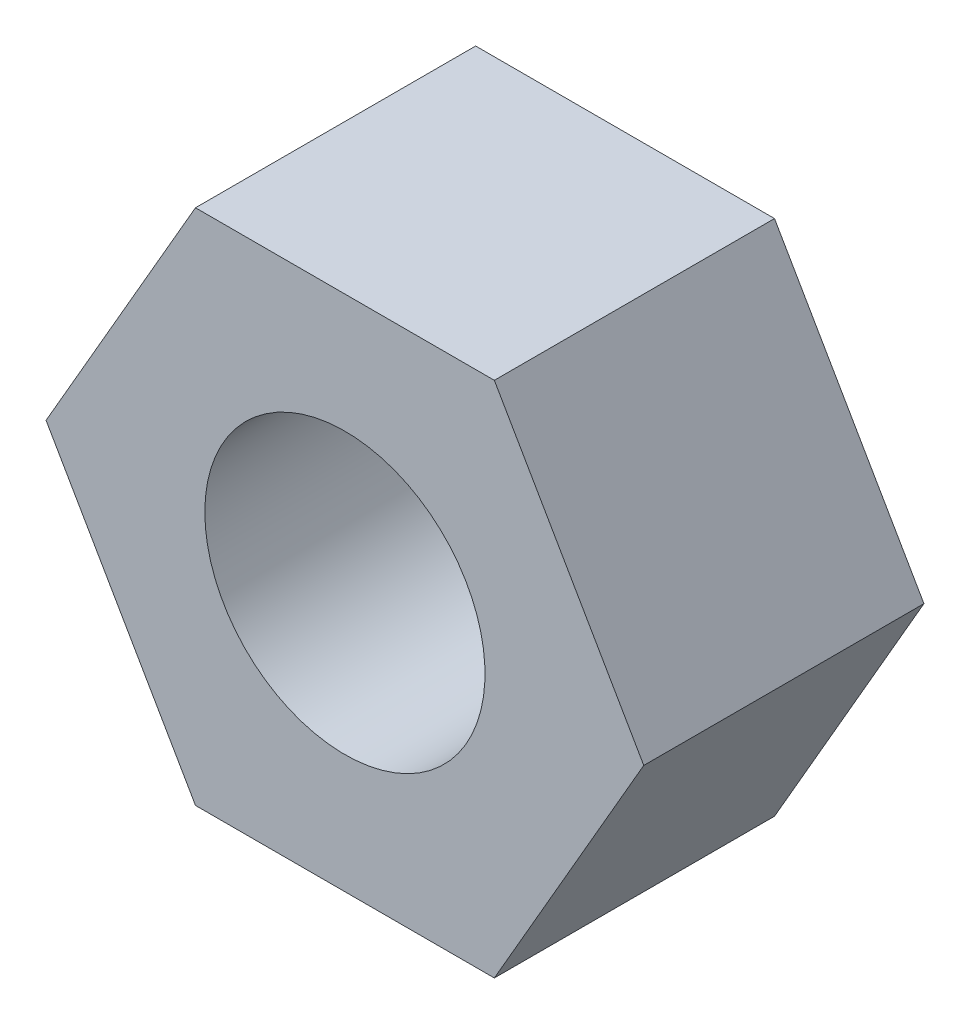
ISO-10303-21;
HEADER;
FILE_DESCRIPTION(('STEP AP214'),'2;1');
FILE_NAME('part.step','',(''),(''),'','','');
FILE_SCHEMA(('AUTOMOTIVE_DESIGN { 1 0 10303 214 1 1 1 1 }'));
ENDSEC;
DATA;
#1=APPLICATION_CONTEXT('core data for automotive mechanical design processes');
#2=APPLICATION_PROTOCOL_DEFINITION('international standard','automotive_design',2000,#1);
#3=PRODUCT_CONTEXT('',#1,'mechanical');
#4=PRODUCT('Part','Part','',(#3));
#5=PRODUCT_RELATED_PRODUCT_CATEGORY('part','',(#4));
#6=PRODUCT_DEFINITION_FORMATION('','',#4);
#7=PRODUCT_DEFINITION_CONTEXT('part definition',#1,'design');
#8=PRODUCT_DEFINITION('design','',#6,#7);
#9=PRODUCT_DEFINITION_SHAPE('','',#8);
#10=(LENGTH_UNIT() NAMED_UNIT(*) SI_UNIT(.MILLI.,.METRE.));
#11=(NAMED_UNIT(*) PLANE_ANGLE_UNIT() SI_UNIT($,.RADIAN.));
#12=(NAMED_UNIT(*) SI_UNIT($,.STERADIAN.) SOLID_ANGLE_UNIT());
#13=UNCERTAINTY_MEASURE_WITH_UNIT(LENGTH_MEASURE(1.E-05),#10,'distance_accuracy_value','');
#14=(GEOMETRIC_REPRESENTATION_CONTEXT(3) GLOBAL_UNCERTAINTY_ASSIGNED_CONTEXT((#13)) GLOBAL_UNIT_ASSIGNED_CONTEXT((#10,
#11,#12)) REPRESENTATION_CONTEXT('',''));
#15=CARTESIAN_POINT('',(0.,0.,0.));
#16=DIRECTION('',(0.,0.,1.));
#17=DIRECTION('',(1.,0.,0.));
#18=AXIS2_PLACEMENT_3D('',#15,#16,#17);
#19=CARTESIAN_POINT('',(3.2,0.,3.));
#20=DIRECTION('',(-0.866025403784439,-0.5,0.));
#21=DIRECTION('',(0.5,-0.866025403784439,0.));
#22=AXIS2_PLACEMENT_3D('',#19,#20,#21);
#23=PLANE('',#22);
#24=DIRECTION('',(-0.5,0.866025403784439,0.));
#25=VECTOR('',#24,1.);
#26=CARTESIAN_POINT('',(3.2,0.,0.));
#27=LINE('',#26,#25);
#28=CARTESIAN_POINT('',(3.2,0.,0.));
#29=VERTEX_POINT('',#28);
#30=CARTESIAN_POINT('',(1.6,2.7712812921102,0.));
#31=VERTEX_POINT('',#30);
#32=EDGE_CURVE('E128',#29,#31,#27,.T.);
#33=ORIENTED_EDGE('',*,*,#32,.T.);
#34=DIRECTION('',(0.,0.,-1.));
#35=VECTOR('',#34,1.);
#36=CARTESIAN_POINT('',(1.6,2.7712812921102,3.));
#37=LINE('',#36,#35);
#38=CARTESIAN_POINT('',(1.6,2.7712812921102,3.));
#39=VERTEX_POINT('',#38);
#40=EDGE_CURVE('E11',#39,#31,#37,.T.);
#41=ORIENTED_EDGE('',*,*,#40,.F.);
#42=DIRECTION('',(-0.5,0.866025403784439,0.));
#43=VECTOR('',#42,1.);
#44=CARTESIAN_POINT('',(3.2,0.,3.));
#45=LINE('',#44,#43);
#46=CARTESIAN_POINT('',(3.2,0.,3.));
#47=VERTEX_POINT('',#46);
#48=EDGE_CURVE('E145',#47,#39,#45,.T.);
#49=ORIENTED_EDGE('',*,*,#48,.F.);
#50=DIRECTION('',(0.,0.,-1.));
#51=VECTOR('',#50,1.);
#52=CARTESIAN_POINT('',(3.2,0.,3.));
#53=LINE('',#52,#51);
#54=EDGE_CURVE('E124',#47,#29,#53,.T.);
#55=ORIENTED_EDGE('',*,*,#54,.T.);
#56=EDGE_LOOP('',(#33,#41,#49,#55));
#57=FACE_BOUND('',#56,.T.);
#58=ADVANCED_FACE('F39',(#57),#23,.F.);
#59=CARTESIAN_POINT('',(1.6,2.7712812921102,3.));
#60=DIRECTION('',(0.,-1.,0.));
#61=DIRECTION('',(0.,0.,-1.));
#62=AXIS2_PLACEMENT_3D('',#59,#60,#61);
#63=PLANE('',#62);
#64=DIRECTION('',(-1.,0.,0.));
#65=VECTOR('',#64,1.);
#66=CARTESIAN_POINT('',(1.6,2.7712812921102,0.));
#67=LINE('',#66,#65);
#68=CARTESIAN_POINT('',(-1.6,2.7712812921102,0.));
#69=VERTEX_POINT('',#68);
#70=EDGE_CURVE('E132',#31,#69,#67,.T.);
#71=ORIENTED_EDGE('',*,*,#70,.T.);
#72=DIRECTION('',(0.,0.,-1.));
#73=VECTOR('',#72,1.);
#74=CARTESIAN_POINT('',(-1.6,2.7712812921102,3.));
#75=LINE('',#74,#73);
#76=CARTESIAN_POINT('',(-1.6,2.7712812921102,3.));
#77=VERTEX_POINT('',#76);
#78=EDGE_CURVE('E48',#77,#69,#75,.T.);
#79=ORIENTED_EDGE('',*,*,#78,.F.);
#80=DIRECTION('',(-1.,0.,0.));
#81=VECTOR('',#80,1.);
#82=CARTESIAN_POINT('',(1.6,2.7712812921102,3.));
#83=LINE('',#82,#81);
#84=EDGE_CURVE('E93',#39,#77,#83,.T.);
#85=ORIENTED_EDGE('',*,*,#84,.F.);
#86=ORIENTED_EDGE('',*,*,#40,.T.);
#87=EDGE_LOOP('',(#71,#79,#85,#86));
#88=FACE_BOUND('',#87,.T.);
#89=ADVANCED_FACE('F174',(#88),#63,.F.);
#90=CARTESIAN_POINT('',(-1.6,2.7712812921102,3.));
#91=DIRECTION('',(0.866025403784439,-0.5,0.));
#92=DIRECTION('',(0.5,0.866025403784439,0.));
#93=AXIS2_PLACEMENT_3D('',#90,#91,#92);
#94=PLANE('',#93);
#95=DIRECTION('',(-0.5,-0.866025403784438,0.));
#96=VECTOR('',#95,1.);
#97=CARTESIAN_POINT('',(-1.6,2.7712812921102,0.));
#98=LINE('',#97,#96);
#99=CARTESIAN_POINT('',(-3.2,0.,0.));
#100=VERTEX_POINT('',#99);
#101=EDGE_CURVE('E136',#69,#100,#98,.T.);
#102=ORIENTED_EDGE('',*,*,#101,.T.);
#103=DIRECTION('',(0.,0.,-1.));
#104=VECTOR('',#103,1.);
#105=CARTESIAN_POINT('',(-3.2,0.,3.));
#106=LINE('',#105,#104);
#107=CARTESIAN_POINT('',(-3.2,0.,3.));
#108=VERTEX_POINT('',#107);
#109=EDGE_CURVE('E117',#108,#100,#106,.T.);
#110=ORIENTED_EDGE('',*,*,#109,.F.);
#111=DIRECTION('',(-0.5,-0.866025403784438,0.));
#112=VECTOR('',#111,1.);
#113=CARTESIAN_POINT('',(-1.6,2.7712812921102,3.));
#114=LINE('',#113,#112);
#115=EDGE_CURVE('E106',#77,#108,#114,.T.);
#116=ORIENTED_EDGE('',*,*,#115,.F.);
#117=ORIENTED_EDGE('',*,*,#78,.T.);
#118=EDGE_LOOP('',(#102,#110,#116,#117));
#119=FACE_BOUND('',#118,.T.);
#120=ADVANCED_FACE('F155',(#119),#94,.F.);
#121=CARTESIAN_POINT('',(-3.2,0.,3.));
#122=DIRECTION('',(0.866025403784439,0.5,0.));
#123=DIRECTION('',(-0.5,0.866025403784439,0.));
#124=AXIS2_PLACEMENT_3D('',#121,#122,#123);
#125=PLANE('',#124);
#126=DIRECTION('',(0.5,-0.866025403784439,0.));
#127=VECTOR('',#126,1.);
#128=CARTESIAN_POINT('',(-3.2,0.,0.));
#129=LINE('',#128,#127);
#130=CARTESIAN_POINT('',(-1.6,-2.7712812921102,0.));
#131=VERTEX_POINT('',#130);
#132=EDGE_CURVE('E115',#100,#131,#129,.T.);
#133=ORIENTED_EDGE('',*,*,#132,.T.);
#134=DIRECTION('',(0.,0.,-1.));
#135=VECTOR('',#134,1.);
#136=CARTESIAN_POINT('',(-1.6,-2.7712812921102,3.));
#137=LINE('',#136,#135);
#138=CARTESIAN_POINT('',(-1.6,-2.7712812921102,3.));
#139=VERTEX_POINT('',#138);
#140=EDGE_CURVE('E112',#139,#131,#137,.T.);
#141=ORIENTED_EDGE('',*,*,#140,.F.);
#142=DIRECTION('',(0.5,-0.866025403784439,0.));
#143=VECTOR('',#142,1.);
#144=CARTESIAN_POINT('',(-3.2,0.,3.));
#145=LINE('',#144,#143);
#146=EDGE_CURVE('E100',#108,#139,#145,.T.);
#147=ORIENTED_EDGE('',*,*,#146,.F.);
#148=ORIENTED_EDGE('',*,*,#109,.T.);
#149=EDGE_LOOP('',(#133,#141,#147,#148));
#150=FACE_BOUND('',#149,.T.);
#151=ADVANCED_FACE('F113',(#150),#125,.F.);
#152=CARTESIAN_POINT('',(-1.6,-2.7712812921102,3.));
#153=DIRECTION('',(0.,1.,0.));
#154=DIRECTION('',(0.,0.,1.));
#155=AXIS2_PLACEMENT_3D('',#152,#153,#154);
#156=PLANE('',#155);
#157=DIRECTION('',(1.,0.,0.));
#158=VECTOR('',#157,1.);
#159=CARTESIAN_POINT('',(-1.6,-2.7712812921102,0.));
#160=LINE('',#159,#158);
#161=CARTESIAN_POINT('',(1.6,-2.7712812921102,0.));
#162=VERTEX_POINT('',#161);
#163=EDGE_CURVE('E79',#131,#162,#160,.T.);
#164=ORIENTED_EDGE('',*,*,#163,.T.);
#165=DIRECTION('',(0.,0.,-1.));
#166=VECTOR('',#165,1.);
#167=CARTESIAN_POINT('',(1.6,-2.7712812921102,3.));
#168=LINE('',#167,#166);
#169=CARTESIAN_POINT('',(1.6,-2.7712812921102,3.));
#170=VERTEX_POINT('',#169);
#171=EDGE_CURVE('E118',#170,#162,#168,.T.);
#172=ORIENTED_EDGE('',*,*,#171,.F.);
#173=DIRECTION('',(1.,0.,0.));
#174=VECTOR('',#173,1.);
#175=CARTESIAN_POINT('',(-1.6,-2.7712812921102,3.));
#176=LINE('',#175,#174);
#177=EDGE_CURVE('E104',#139,#170,#176,.T.);
#178=ORIENTED_EDGE('',*,*,#177,.F.);
#179=ORIENTED_EDGE('',*,*,#140,.T.);
#180=EDGE_LOOP('',(#164,#172,#178,#179));
#181=FACE_BOUND('',#180,.T.);
#182=ADVANCED_FACE('F120',(#181),#156,.F.);
#183=CARTESIAN_POINT('',(1.6,-2.7712812921102,3.));
#184=DIRECTION('',(-0.866025403784439,0.5,0.));
#185=DIRECTION('',(-0.5,-0.866025403784439,0.));
#186=AXIS2_PLACEMENT_3D('',#183,#184,#185);
#187=PLANE('',#186);
#188=DIRECTION('',(0.5,0.866025403784438,0.));
#189=VECTOR('',#188,1.);
#190=CARTESIAN_POINT('',(1.6,-2.7712812921102,0.));
#191=LINE('',#190,#189);
#192=EDGE_CURVE('E85',#162,#29,#191,.T.);
#193=ORIENTED_EDGE('',*,*,#192,.T.);
#194=ORIENTED_EDGE('',*,*,#54,.F.);
#195=DIRECTION('',(0.5,0.866025403784438,0.));
#196=VECTOR('',#195,1.);
#197=CARTESIAN_POINT('',(1.6,-2.7712812921102,3.));
#198=LINE('',#197,#196);
#199=EDGE_CURVE('E56',#170,#47,#198,.T.);
#200=ORIENTED_EDGE('',*,*,#199,.F.);
#201=ORIENTED_EDGE('',*,*,#171,.T.);
#202=EDGE_LOOP('',(#193,#194,#200,#201));
#203=FACE_BOUND('',#202,.T.);
#204=ADVANCED_FACE('F162',(#203),#187,.F.);
#205=CARTESIAN_POINT('',(0.,0.,3.));
#206=DIRECTION('',(0.,0.,1.));
#207=DIRECTION('',(1.,0.,0.));
#208=AXIS2_PLACEMENT_3D('',#205,#206,#207);
#209=PLANE('',#208);
#210=CARTESIAN_POINT('',(0.,0.,3.));
#211=DIRECTION('',(0.,0.,-1.));
#212=DIRECTION('',(-1.,0.,0.));
#213=AXIS2_PLACEMENT_3D('',#210,#211,#212);
#214=CIRCLE('',#213,1.5);
#215=CARTESIAN_POINT('',(-1.5,0.,3.));
#216=VERTEX_POINT('',#215);
#217=EDGE_CURVE('E133',#216,#216,#214,.T.);
#218=ORIENTED_EDGE('',*,*,#217,.T.);
#219=EDGE_LOOP('',(#218));
#220=FACE_BOUND('',#219,.T.);
#221=ORIENTED_EDGE('',*,*,#48,.T.);
#222=ORIENTED_EDGE('',*,*,#84,.T.);
#223=ORIENTED_EDGE('',*,*,#115,.T.);
#224=ORIENTED_EDGE('',*,*,#146,.T.);
#225=ORIENTED_EDGE('',*,*,#177,.T.);
#226=ORIENTED_EDGE('',*,*,#199,.T.);
#227=EDGE_LOOP('',(#221,#222,#223,#224,#225,#226));
#228=FACE_BOUND('',#227,.T.);
#229=ADVANCED_FACE('F102',(#220,#228),#209,.T.);
#230=CARTESIAN_POINT('',(0.,0.,0.));
#231=DIRECTION('',(0.,0.,1.));
#232=DIRECTION('',(1.,0.,0.));
#233=AXIS2_PLACEMENT_3D('',#230,#231,#232);
#234=PLANE('',#233);
#235=CARTESIAN_POINT('',(0.,0.,0.));
#236=DIRECTION('',(0.,0.,-1.));
#237=DIRECTION('',(-1.,0.,0.));
#238=AXIS2_PLACEMENT_3D('',#235,#236,#237);
#239=CIRCLE('',#238,1.5);
#240=CARTESIAN_POINT('',(-1.5,0.,0.));
#241=VERTEX_POINT('',#240);
#242=EDGE_CURVE('E229',#241,#241,#239,.T.);
#243=ORIENTED_EDGE('',*,*,#242,.F.);
#244=EDGE_LOOP('',(#243));
#245=FACE_BOUND('',#244,.T.);
#246=ORIENTED_EDGE('',*,*,#32,.F.);
#247=ORIENTED_EDGE('',*,*,#192,.F.);
#248=ORIENTED_EDGE('',*,*,#163,.F.);
#249=ORIENTED_EDGE('',*,*,#132,.F.);
#250=ORIENTED_EDGE('',*,*,#101,.F.);
#251=ORIENTED_EDGE('',*,*,#70,.F.);
#252=EDGE_LOOP('',(#246,#247,#248,#249,#250,#251));
#253=FACE_BOUND('',#252,.T.);
#254=ADVANCED_FACE('F158',(#245,#253),#234,.F.);
#255=CARTESIAN_POINT('',(0.,0.,3.));
#256=DIRECTION('',(0.,0.,-1.));
#257=DIRECTION('',(-1.,0.,0.));
#258=AXIS2_PLACEMENT_3D('',#255,#256,#257);
#259=CYLINDRICAL_SURFACE('',#258,1.5);
#260=ORIENTED_EDGE('',*,*,#217,.F.);
#261=EDGE_LOOP('',(#260));
#262=FACE_BOUND('',#261,.T.);
#263=ORIENTED_EDGE('',*,*,#242,.T.);
#264=EDGE_LOOP('',(#263));
#265=FACE_BOUND('',#264,.T.);
#266=ADVANCED_FACE('F211',(#262,#265),#259,.F.);
#267=CLOSED_SHELL('',(#58,#89,#120,#151,#182,#204,#229,#254,#266));
#268=MANIFOLD_SOLID_BREP('B2',#267);
#269=ADVANCED_BREP_SHAPE_REPRESENTATION('',(#18,#268),#14);
#270=SHAPE_DEFINITION_REPRESENTATION(#9,#269);
ENDSEC;
END-ISO-10303-21;
